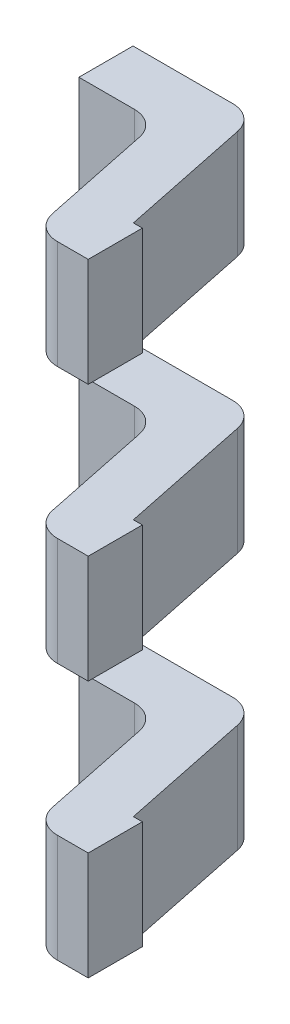
ISO-10303-21;
HEADER;
FILE_DESCRIPTION(('STEP AP214'),'2;1');
FILE_NAME('part.step','',(''),(''),'','','');
FILE_SCHEMA(('AUTOMOTIVE_DESIGN { 1 0 10303 214 1 1 1 1 }'));
ENDSEC;
DATA;
#1=APPLICATION_CONTEXT('core data for automotive mechanical design processes');
#2=APPLICATION_PROTOCOL_DEFINITION('international standard','automotive_design',2000,#1);
#3=PRODUCT_CONTEXT('',#1,'mechanical');
#4=PRODUCT('Part','Part','',(#3));
#5=PRODUCT_RELATED_PRODUCT_CATEGORY('part','',(#4));
#6=PRODUCT_DEFINITION_FORMATION('','',#4);
#7=PRODUCT_DEFINITION_CONTEXT('part definition',#1,'design');
#8=PRODUCT_DEFINITION('design','',#6,#7);
#9=PRODUCT_DEFINITION_SHAPE('','',#8);
#10=(LENGTH_UNIT() NAMED_UNIT(*) SI_UNIT(.MILLI.,.METRE.));
#11=(NAMED_UNIT(*) PLANE_ANGLE_UNIT() SI_UNIT($,.RADIAN.));
#12=(NAMED_UNIT(*) SI_UNIT($,.STERADIAN.) SOLID_ANGLE_UNIT());
#13=UNCERTAINTY_MEASURE_WITH_UNIT(LENGTH_MEASURE(1.E-05),#10,'distance_accuracy_value','');
#14=(GEOMETRIC_REPRESENTATION_CONTEXT(3) GLOBAL_UNCERTAINTY_ASSIGNED_CONTEXT((#13)) GLOBAL_UNIT_ASSIGNED_CONTEXT((#10,
#11,#12)) REPRESENTATION_CONTEXT('',''));
#15=CARTESIAN_POINT('',(0.,0.,0.));
#16=DIRECTION('',(0.,0.,1.));
#17=DIRECTION('',(1.,0.,0.));
#18=AXIS2_PLACEMENT_3D('',#15,#16,#17);
#19=CARTESIAN_POINT('',(-1.053576311495,0.75,0.325748771871));
#20=DIRECTION('',(0.,-1.,0.));
#21=DIRECTION('',(1.,0.,0.));
#22=AXIS2_PLACEMENT_3D('',#19,#20,#21);
#23=PLANE('',#22);
#24=DIRECTION('',(1.,0.,0.));
#25=VECTOR('',#24,1.);
#26=CARTESIAN_POINT('',(-1.4,0.75,0.2));
#27=LINE('',#26,#25);
#28=CARTESIAN_POINT('',(-1.4,0.75,0.2));
#29=VERTEX_POINT('',#28);
#30=CARTESIAN_POINT('',(-1.194284680585,0.75,0.2));
#31=VERTEX_POINT('',#30);
#32=EDGE_CURVE('P0_E86',#29,#31,#27,.T.);
#33=ORIENTED_EDGE('',*,*,#32,.F.);
#34=DIRECTION('',(0.,0.,-1.));
#35=VECTOR('',#34,1.);
#36=CARTESIAN_POINT('',(-1.4,0.75,0.));
#37=LINE('',#36,#35);
#38=CARTESIAN_POINT('',(-1.4,0.75,0.));
#39=VERTEX_POINT('',#38);
#40=EDGE_CURVE('P0_E92',#29,#39,#37,.T.);
#41=ORIENTED_EDGE('',*,*,#40,.T.);
#42=DIRECTION('',(1.,0.,0.));
#43=VECTOR('',#42,1.);
#44=CARTESIAN_POINT('',(-1.4,0.75,0.));
#45=LINE('',#44,#43);
#46=CARTESIAN_POINT('',(-1.031428226862,0.75,0.));
#47=VERTEX_POINT('',#46);
#48=EDGE_CURVE('P0_E178',#39,#47,#45,.T.);
#49=ORIENTED_EDGE('',*,*,#48,.T.);
#50=CARTESIAN_POINT('',(-1.031428226862,0.75,0.1));
#51=DIRECTION('',(0.,1.,0.));
#52=DIRECTION('',(0.,0.,1.));
#53=AXIS2_PLACEMENT_3D('',#50,#51,#52);
#54=CIRCLE('',#53,0.1);
#55=CARTESIAN_POINT('',(-0.933502184911186,0.75,0.0797394395964074));
#56=VERTEX_POINT('',#55);
#57=EDGE_CURVE('P0_E204',#56,#47,#54,.T.);
#58=ORIENTED_EDGE('',*,*,#57,.F.);
#59=DIRECTION('',(-0.202605604036018,0.,-0.979260419507089));
#60=VECTOR('',#59,1.);
#61=CARTESIAN_POINT('',(-0.95,0.75,0.));
#62=LINE('',#61,#60);
#63=CARTESIAN_POINT('',(-0.83299563017783,0.75,0.565521120806977));
#64=VERTEX_POINT('',#63);
#65=EDGE_CURVE('P0_E121',#64,#56,#62,.T.);
#66=ORIENTED_EDGE('',*,*,#65,.F.);
#67=DIRECTION('',(1.,0.,0.));
#68=VECTOR('',#67,1.);
#69=CARTESIAN_POINT('',(-0.995852083901,0.75,0.565521120807));
#70=LINE('',#69,#68);
#71=CARTESIAN_POINT('',(-0.8,0.75,0.565521120807));
#72=VERTEX_POINT('',#71);
#73=EDGE_CURVE('P0_E122',#64,#72,#70,.T.);
#74=ORIENTED_EDGE('',*,*,#73,.T.);
#75=DIRECTION('',(0.,0.,-1.));
#76=VECTOR('',#75,1.);
#77=CARTESIAN_POINT('',(-0.8,0.75,0.565521120807));
#78=LINE('',#77,#76);
#79=CARTESIAN_POINT('',(-0.8,0.75,0.765521120807));
#80=VERTEX_POINT('',#79);
#81=EDGE_CURVE('P0_E118',#80,#72,#78,.T.);
#82=ORIENTED_EDGE('',*,*,#81,.F.);
#83=DIRECTION('',(1.,0.,0.));
#84=VECTOR('',#83,1.);
#85=CARTESIAN_POINT('',(-0.995852083901,0.75,0.765521120807));
#86=LINE('',#85,#84);
#87=CARTESIAN_POINT('',(-0.91442385704,0.75,0.765521120807));
#88=VERTEX_POINT('',#87);
#89=EDGE_CURVE('P0_E151',#88,#80,#86,.T.);
#90=ORIENTED_EDGE('',*,*,#89,.F.);
#91=CARTESIAN_POINT('',(-0.91442385704,0.75,0.665521120807));
#92=DIRECTION('',(0.,1.,0.));
#93=DIRECTION('',(0.,0.,1.));
#94=AXIS2_PLACEMENT_3D('',#91,#92,#93);
#95=CIRCLE('',#94,0.1);
#96=CARTESIAN_POINT('',(-1.01234989899027,0.75,0.685781681210783));
#97=VERTEX_POINT('',#96);
#98=EDGE_CURVE('P0_E155',#97,#88,#95,.T.);
#99=ORIENTED_EDGE('',*,*,#98,.F.);
#100=DIRECTION('',(-0.202605604036018,0.,-0.979260419507089));
#101=VECTOR('',#100,1.);
#102=CARTESIAN_POINT('',(-1.145852083901,0.75,0.04052112080719));
#103=LINE('',#102,#101);
#104=CARTESIAN_POINT('',(-1.09635863863431,0.75,0.279739439596129));
#105=VERTEX_POINT('',#104);
#106=EDGE_CURVE('P0_E79',#97,#105,#103,.T.);
#107=ORIENTED_EDGE('',*,*,#106,.T.);
#108=CARTESIAN_POINT('',(-1.194284680585,0.75,0.3));
#109=DIRECTION('',(0.,1.,0.));
#110=DIRECTION('',(0.,0.,1.));
#111=AXIS2_PLACEMENT_3D('',#108,#109,#110);
#112=CIRCLE('',#111,0.1);
#113=EDGE_CURVE('P0_E20',#105,#31,#112,.T.);
#114=ORIENTED_EDGE('',*,*,#113,.T.);
#115=EDGE_LOOP('',(#33,#41,#49,#58,#66,#74,#82,#90,#99,#107,#114));
#116=FACE_BOUND('',#115,.T.);
#117=ADVANCED_FACE('P0_F17',(#116),#23,.T.);
#118=CARTESIAN_POINT('',(-1.4,0.75,0.));
#119=DIRECTION('',(0.,0.,1.));
#120=DIRECTION('',(1.,0.,0.));
#121=AXIS2_PLACEMENT_3D('',#118,#119,#120);
#122=PLANE('',#121);
#123=ORIENTED_EDGE('',*,*,#48,.F.);
#124=DIRECTION('',(0.,1.,0.));
#125=VECTOR('',#124,1.);
#126=CARTESIAN_POINT('',(-1.4,0.75,0.));
#127=LINE('',#126,#125);
#128=CARTESIAN_POINT('',(-1.4,1.15,0.));
#129=VERTEX_POINT('',#128);
#130=EDGE_CURVE('P0_E162',#39,#129,#127,.T.);
#131=ORIENTED_EDGE('',*,*,#130,.T.);
#132=DIRECTION('',(-1.,0.,0.));
#133=VECTOR('',#132,1.);
#134=CARTESIAN_POINT('',(-1.053576311495,1.15,0.));
#135=LINE('',#134,#133);
#136=CARTESIAN_POINT('',(-1.031428226862,1.15,0.));
#137=VERTEX_POINT('',#136);
#138=EDGE_CURVE('P0_E169',#137,#129,#135,.T.);
#139=ORIENTED_EDGE('',*,*,#138,.F.);
#140=DIRECTION('',(0.,1.,0.));
#141=VECTOR('',#140,1.);
#142=CARTESIAN_POINT('',(-1.031428226862,0.75,0.));
#143=LINE('',#142,#141);
#144=EDGE_CURVE('P0_E229',#47,#137,#143,.T.);
#145=ORIENTED_EDGE('',*,*,#144,.F.);
#146=EDGE_LOOP('',(#123,#131,#139,#145));
#147=FACE_BOUND('',#146,.T.);
#148=ADVANCED_FACE('P0_F247',(#147),#122,.F.);
#149=CARTESIAN_POINT('',(-1.4,0.75,0.));
#150=DIRECTION('',(1.,0.,0.));
#151=DIRECTION('',(0.,0.,-1.));
#152=AXIS2_PLACEMENT_3D('',#149,#150,#151);
#153=PLANE('',#152);
#154=DIRECTION('',(0.,0.,1.));
#155=VECTOR('',#154,1.);
#156=CARTESIAN_POINT('',(-1.4,1.15,0.325748771871));
#157=LINE('',#156,#155);
#158=CARTESIAN_POINT('',(-1.4,1.15,0.2));
#159=VERTEX_POINT('',#158);
#160=EDGE_CURVE('P0_E165',#129,#159,#157,.T.);
#161=ORIENTED_EDGE('',*,*,#160,.F.);
#162=ORIENTED_EDGE('',*,*,#130,.F.);
#163=ORIENTED_EDGE('',*,*,#40,.F.);
#164=DIRECTION('',(0.,1.,0.));
#165=VECTOR('',#164,1.);
#166=CARTESIAN_POINT('',(-1.4,0.75,0.2));
#167=LINE('',#166,#165);
#168=EDGE_CURVE('P0_E160',#159,#29,#167,.F.);
#169=ORIENTED_EDGE('',*,*,#168,.F.);
#170=EDGE_LOOP('',(#161,#162,#163,#169));
#171=FACE_BOUND('',#170,.T.);
#172=ADVANCED_FACE('P0_F249',(#171),#153,.F.);
#173=CARTESIAN_POINT('',(-1.4,0.75,0.2));
#174=DIRECTION('',(0.,0.,1.));
#175=DIRECTION('',(1.,0.,0.));
#176=AXIS2_PLACEMENT_3D('',#173,#174,#175);
#177=PLANE('',#176);
#178=ORIENTED_EDGE('',*,*,#32,.T.);
#179=DIRECTION('',(0.,1.,0.));
#180=VECTOR('',#179,1.);
#181=CARTESIAN_POINT('',(-1.194284680585,0.75,0.2));
#182=LINE('',#181,#180);
#183=CARTESIAN_POINT('',(-1.194284680585,1.15,0.2));
#184=VERTEX_POINT('',#183);
#185=EDGE_CURVE('P0_E158',#31,#184,#182,.T.);
#186=ORIENTED_EDGE('',*,*,#185,.T.);
#187=DIRECTION('',(-1.,0.,0.));
#188=VECTOR('',#187,1.);
#189=CARTESIAN_POINT('',(-1.053576311495,1.15,0.2));
#190=LINE('',#189,#188);
#191=EDGE_CURVE('P0_E168',#159,#184,#190,.F.);
#192=ORIENTED_EDGE('',*,*,#191,.F.);
#193=ORIENTED_EDGE('',*,*,#168,.T.);
#194=EDGE_LOOP('',(#178,#186,#192,#193));
#195=FACE_BOUND('',#194,.T.);
#196=ADVANCED_FACE('P0_F251',(#195),#177,.T.);
#197=CARTESIAN_POINT('',(-1.194284680585,0.75,0.3));
#198=DIRECTION('',(0.,1.,0.));
#199=DIRECTION('',(0.,0.,1.));
#200=AXIS2_PLACEMENT_3D('',#197,#198,#199);
#201=CYLINDRICAL_SURFACE('',#200,0.1);
#202=DIRECTION('',(0.,1.,0.));
#203=VECTOR('',#202,1.);
#204=CARTESIAN_POINT('',(-1.09635863863436,0.75,0.279739439595868));
#205=LINE('',#204,#203);
#206=CARTESIAN_POINT('',(-1.09635863863464,1.15,0.279739439596139));
#207=VERTEX_POINT('',#206);
#208=EDGE_CURVE('P0_E156',#105,#207,#205,.T.);
#209=ORIENTED_EDGE('',*,*,#208,.T.);
#210=CARTESIAN_POINT('',(-1.194284680585,1.15,0.3));
#211=DIRECTION('',(0.,1.,0.));
#212=DIRECTION('',(0.,0.,1.));
#213=AXIS2_PLACEMENT_3D('',#210,#211,#212);
#214=CIRCLE('',#213,0.1);
#215=EDGE_CURVE('P0_E201',#184,#207,#214,.F.);
#216=ORIENTED_EDGE('',*,*,#215,.F.);
#217=ORIENTED_EDGE('',*,*,#185,.F.);
#218=ORIENTED_EDGE('',*,*,#113,.F.);
#219=EDGE_LOOP('',(#209,#216,#217,#218));
#220=FACE_BOUND('',#219,.T.);
#221=ADVANCED_FACE('P0_F254',(#220),#201,.F.);
#222=CARTESIAN_POINT('',(-1.145852083901,0.75,0.04052112080719));
#223=DIRECTION('',(0.979260419507089,0.,-0.202605604036018));
#224=DIRECTION('',(-0.202605604036018,0.,-0.979260419507089));
#225=AXIS2_PLACEMENT_3D('',#222,#223,#224);
#226=PLANE('',#225);
#227=DIRECTION('',(0.202605604037148,0.,0.979260419506855));
#228=VECTOR('',#227,1.);
#229=CARTESIAN_POINT('',(-1.096358638635,1.15,0.279739439596));
#230=LINE('',#229,#228);
#231=CARTESIAN_POINT('',(-1.01234989899034,1.15,0.685781681210857));
#232=VERTEX_POINT('',#231);
#233=EDGE_CURVE('P0_E200',#207,#232,#230,.T.);
#234=ORIENTED_EDGE('',*,*,#233,.F.);
#235=ORIENTED_EDGE('',*,*,#208,.F.);
#236=ORIENTED_EDGE('',*,*,#106,.F.);
#237=DIRECTION('',(0.,1.,0.));
#238=VECTOR('',#237,1.);
#239=CARTESIAN_POINT('',(-1.0123498989906,0.75,0.685781681211124));
#240=LINE('',#239,#238);
#241=EDGE_CURVE('P0_E152',#232,#97,#240,.F.);
#242=ORIENTED_EDGE('',*,*,#241,.F.);
#243=EDGE_LOOP('',(#234,#235,#236,#242));
#244=FACE_BOUND('',#243,.T.);
#245=ADVANCED_FACE('P0_F255',(#244),#226,.F.);
#246=CARTESIAN_POINT('',(-0.91442385704,0.75,0.665521120807));
#247=DIRECTION('',(0.,1.,0.));
#248=DIRECTION('',(0.,0.,1.));
#249=AXIS2_PLACEMENT_3D('',#246,#247,#248);
#250=CYLINDRICAL_SURFACE('',#249,0.1);
#251=CARTESIAN_POINT('',(-0.91442385704,1.15,0.665521120807));
#252=DIRECTION('',(0.,1.,0.));
#253=DIRECTION('',(0.,0.,1.));
#254=AXIS2_PLACEMENT_3D('',#251,#252,#253);
#255=CIRCLE('',#254,0.1);
#256=CARTESIAN_POINT('',(-0.91442385704,1.15,0.765521120807));
#257=VERTEX_POINT('',#256);
#258=EDGE_CURVE('P0_E137',#232,#257,#255,.T.);
#259=ORIENTED_EDGE('',*,*,#258,.F.);
#260=ORIENTED_EDGE('',*,*,#241,.T.);
#261=ORIENTED_EDGE('',*,*,#98,.T.);
#262=DIRECTION('',(0.,1.,0.));
#263=VECTOR('',#262,1.);
#264=CARTESIAN_POINT('',(-0.91442385704,0.75,0.765521120807));
#265=LINE('',#264,#263);
#266=EDGE_CURVE('P0_E148',#257,#88,#265,.F.);
#267=ORIENTED_EDGE('',*,*,#266,.F.);
#268=EDGE_LOOP('',(#259,#260,#261,#267));
#269=FACE_BOUND('',#268,.T.);
#270=ADVANCED_FACE('P0_F209',(#269),#250,.T.);
#271=CARTESIAN_POINT('',(-0.995852083901,0.75,0.765521120807));
#272=DIRECTION('',(0.,0.,1.));
#273=DIRECTION('',(1.,0.,0.));
#274=AXIS2_PLACEMENT_3D('',#271,#272,#273);
#275=PLANE('',#274);
#276=DIRECTION('',(-1.,0.,0.));
#277=VECTOR('',#276,1.);
#278=CARTESIAN_POINT('',(-1.053576311495,1.15,0.765521120807));
#279=LINE('',#278,#277);
#280=CARTESIAN_POINT('',(-0.8,1.15,0.765521120807));
#281=VERTEX_POINT('',#280);
#282=EDGE_CURVE('P0_E135',#257,#281,#279,.F.);
#283=ORIENTED_EDGE('',*,*,#282,.F.);
#284=ORIENTED_EDGE('',*,*,#266,.T.);
#285=ORIENTED_EDGE('',*,*,#89,.T.);
#286=DIRECTION('',(0.,1.,0.));
#287=VECTOR('',#286,1.);
#288=CARTESIAN_POINT('',(-0.8,0.75,0.765521120807));
#289=LINE('',#288,#287);
#290=EDGE_CURVE('P0_E144',#281,#80,#289,.F.);
#291=ORIENTED_EDGE('',*,*,#290,.F.);
#292=EDGE_LOOP('',(#283,#284,#285,#291));
#293=FACE_BOUND('',#292,.T.);
#294=ADVANCED_FACE('P0_F211',(#293),#275,.T.);
#295=CARTESIAN_POINT('',(-0.8,0.75,0.565521120807));
#296=DIRECTION('',(1.,0.,0.));
#297=DIRECTION('',(0.,0.,-1.));
#298=AXIS2_PLACEMENT_3D('',#295,#296,#297);
#299=PLANE('',#298);
#300=DIRECTION('',(0.,0.,1.));
#301=VECTOR('',#300,1.);
#302=CARTESIAN_POINT('',(-0.8,1.15,0.325748771871));
#303=LINE('',#302,#301);
#304=CARTESIAN_POINT('',(-0.8,1.15,0.565521120807));
#305=VERTEX_POINT('',#304);
#306=EDGE_CURVE('P0_E116',#281,#305,#303,.F.);
#307=ORIENTED_EDGE('',*,*,#306,.F.);
#308=ORIENTED_EDGE('',*,*,#290,.T.);
#309=ORIENTED_EDGE('',*,*,#81,.T.);
#310=DIRECTION('',(0.,1.,0.));
#311=VECTOR('',#310,1.);
#312=CARTESIAN_POINT('',(-0.8,0.75,0.565521120807));
#313=LINE('',#312,#311);
#314=EDGE_CURVE('P0_E111',#72,#305,#313,.T.);
#315=ORIENTED_EDGE('',*,*,#314,.T.);
#316=EDGE_LOOP('',(#307,#308,#309,#315));
#317=FACE_BOUND('',#316,.T.);
#318=ADVANCED_FACE('P0_F113',(#317),#299,.T.);
#319=CARTESIAN_POINT('',(-0.995852083901,0.75,0.565521120807));
#320=DIRECTION('',(0.,0.,1.));
#321=DIRECTION('',(1.,0.,0.));
#322=AXIS2_PLACEMENT_3D('',#319,#320,#321);
#323=PLANE('',#322);
#324=ORIENTED_EDGE('',*,*,#73,.F.);
#325=DIRECTION('',(0.,1.,0.));
#326=VECTOR('',#325,1.);
#327=CARTESIAN_POINT('',(-0.83299563017783,0.75,0.565521120806965));
#328=LINE('',#327,#326);
#329=CARTESIAN_POINT('',(-0.832995630177943,1.15,0.565521120806988));
#330=VERTEX_POINT('',#329);
#331=EDGE_CURVE('P0_E128',#330,#64,#328,.F.);
#332=ORIENTED_EDGE('',*,*,#331,.F.);
#333=DIRECTION('',(-1.,0.,0.));
#334=VECTOR('',#333,1.);
#335=CARTESIAN_POINT('',(-1.053576311495,1.15,0.565521120807));
#336=LINE('',#335,#334);
#337=EDGE_CURVE('P0_E125',#305,#330,#336,.T.);
#338=ORIENTED_EDGE('',*,*,#337,.F.);
#339=ORIENTED_EDGE('',*,*,#314,.F.);
#340=EDGE_LOOP('',(#324,#332,#338,#339));
#341=FACE_BOUND('',#340,.T.);
#342=ADVANCED_FACE('P0_F126',(#341),#323,.F.);
#343=CARTESIAN_POINT('',(-0.95,0.75,0.));
#344=DIRECTION('',(0.979260419507089,0.,-0.202605604036018));
#345=DIRECTION('',(-0.202605604036018,0.,-0.979260419507089));
#346=AXIS2_PLACEMENT_3D('',#343,#344,#345);
#347=PLANE('',#346);
#348=DIRECTION('',(-0.202605604035512,0.,-0.979260419507194));
#349=VECTOR('',#348,1.);
#350=CARTESIAN_POINT('',(-0.832995630178,1.15,0.565521120807));
#351=LINE('',#350,#349);
#352=CARTESIAN_POINT('',(-0.93350218491114,1.15,0.0797394395964244));
#353=VERTEX_POINT('',#352);
#354=EDGE_CURVE('P0_E26',#330,#353,#351,.T.);
#355=ORIENTED_EDGE('',*,*,#354,.F.);
#356=ORIENTED_EDGE('',*,*,#331,.T.);
#357=ORIENTED_EDGE('',*,*,#65,.T.);
#358=DIRECTION('',(0.,1.,0.));
#359=VECTOR('',#358,1.);
#360=CARTESIAN_POINT('',(-0.933502184911279,0.75,0.0797394395964577));
#361=LINE('',#360,#359);
#362=EDGE_CURVE('P0_E35',#353,#56,#361,.F.);
#363=ORIENTED_EDGE('',*,*,#362,.F.);
#364=EDGE_LOOP('',(#355,#356,#357,#363));
#365=FACE_BOUND('',#364,.T.);
#366=ADVANCED_FACE('P0_F237',(#365),#347,.T.);
#367=CARTESIAN_POINT('',(-1.031428226862,0.75,0.1));
#368=DIRECTION('',(0.,1.,0.));
#369=DIRECTION('',(0.,0.,1.));
#370=AXIS2_PLACEMENT_3D('',#367,#368,#369);
#371=CYLINDRICAL_SURFACE('',#370,0.1);
#372=ORIENTED_EDGE('',*,*,#362,.T.);
#373=ORIENTED_EDGE('',*,*,#57,.T.);
#374=ORIENTED_EDGE('',*,*,#144,.T.);
#375=CARTESIAN_POINT('',(-1.031428226862,1.15,0.1));
#376=DIRECTION('',(0.,1.,0.));
#377=DIRECTION('',(0.,0.,1.));
#378=AXIS2_PLACEMENT_3D('',#375,#376,#377);
#379=CIRCLE('',#378,0.1);
#380=EDGE_CURVE('P0_E11',#353,#137,#379,.T.);
#381=ORIENTED_EDGE('',*,*,#380,.F.);
#382=EDGE_LOOP('',(#372,#373,#374,#381));
#383=FACE_BOUND('',#382,.T.);
#384=ADVANCED_FACE('P0_F243',(#383),#371,.T.);
#385=CARTESIAN_POINT('',(-1.053576311495,1.15,0.325748771871));
#386=DIRECTION('',(0.,1.,0.));
#387=DIRECTION('',(-1.,0.,0.));
#388=AXIS2_PLACEMENT_3D('',#385,#386,#387);
#389=PLANE('',#388);
#390=ORIENTED_EDGE('',*,*,#354,.T.);
#391=ORIENTED_EDGE('',*,*,#380,.T.);
#392=ORIENTED_EDGE('',*,*,#138,.T.);
#393=ORIENTED_EDGE('',*,*,#160,.T.);
#394=ORIENTED_EDGE('',*,*,#191,.T.);
#395=ORIENTED_EDGE('',*,*,#215,.T.);
#396=ORIENTED_EDGE('',*,*,#233,.T.);
#397=ORIENTED_EDGE('',*,*,#258,.T.);
#398=ORIENTED_EDGE('',*,*,#282,.T.);
#399=ORIENTED_EDGE('',*,*,#306,.T.);
#400=ORIENTED_EDGE('',*,*,#337,.T.);
#401=EDGE_LOOP('',(#390,#391,#392,#393,#394,#395,#396,#397,#398,#399,#400));
#402=FACE_BOUND('',#401,.T.);
#403=ADVANCED_FACE('P0_F132',(#402),#389,.T.);
#404=CLOSED_SHELL('',(#117,#148,#172,#196,#221,#245,#270,#294,#318,#342,#366,#384,#403));
#405=MANIFOLD_SOLID_BREP('P0_B1',#404);
#406=CARTESIAN_POINT('',(-1.053576311495,-0.2,0.325748771871));
#407=DIRECTION('',(0.,-1.,0.));
#408=DIRECTION('',(1.,0.,0.));
#409=AXIS2_PLACEMENT_3D('',#406,#407,#408);
#410=PLANE('',#409);
#411=DIRECTION('',(1.,0.,0.));
#412=VECTOR('',#411,1.);
#413=CARTESIAN_POINT('',(-1.4,-0.2,0.2));
#414=LINE('',#413,#412);
#415=CARTESIAN_POINT('',(-1.4,-0.2,0.2));
#416=VERTEX_POINT('',#415);
#417=CARTESIAN_POINT('',(-1.194284680585,-0.2,0.2));
#418=VERTEX_POINT('',#417);
#419=EDGE_CURVE('P1_E86',#416,#418,#414,.T.);
#420=ORIENTED_EDGE('',*,*,#419,.F.);
#421=DIRECTION('',(0.,0.,-1.));
#422=VECTOR('',#421,1.);
#423=CARTESIAN_POINT('',(-1.4,-0.2,0.));
#424=LINE('',#423,#422);
#425=CARTESIAN_POINT('',(-1.4,-0.2,0.));
#426=VERTEX_POINT('',#425);
#427=EDGE_CURVE('P1_E92',#416,#426,#424,.T.);
#428=ORIENTED_EDGE('',*,*,#427,.T.);
#429=DIRECTION('',(1.,0.,0.));
#430=VECTOR('',#429,1.);
#431=CARTESIAN_POINT('',(-1.4,-0.2,0.));
#432=LINE('',#431,#430);
#433=CARTESIAN_POINT('',(-1.031428226862,-0.2,0.));
#434=VERTEX_POINT('',#433);
#435=EDGE_CURVE('P1_E178',#426,#434,#432,.T.);
#436=ORIENTED_EDGE('',*,*,#435,.T.);
#437=CARTESIAN_POINT('',(-1.031428226862,-0.2,0.1));
#438=DIRECTION('',(0.,1.,0.));
#439=DIRECTION('',(0.,0.,1.));
#440=AXIS2_PLACEMENT_3D('',#437,#438,#439);
#441=CIRCLE('',#440,0.1);
#442=CARTESIAN_POINT('',(-0.933502184911186,-0.2,0.0797394395964074));
#443=VERTEX_POINT('',#442);
#444=EDGE_CURVE('P1_E204',#443,#434,#441,.T.);
#445=ORIENTED_EDGE('',*,*,#444,.F.);
#446=DIRECTION('',(-0.202605604036018,0.,-0.979260419507089));
#447=VECTOR('',#446,1.);
#448=CARTESIAN_POINT('',(-0.95,-0.2,0.));
#449=LINE('',#448,#447);
#450=CARTESIAN_POINT('',(-0.83299563017783,-0.2,0.565521120806977));
#451=VERTEX_POINT('',#450);
#452=EDGE_CURVE('P1_E121',#451,#443,#449,.T.);
#453=ORIENTED_EDGE('',*,*,#452,.F.);
#454=DIRECTION('',(1.,0.,0.));
#455=VECTOR('',#454,1.);
#456=CARTESIAN_POINT('',(-0.995852083901,-0.2,0.565521120807));
#457=LINE('',#456,#455);
#458=CARTESIAN_POINT('',(-0.8,-0.2,0.565521120807));
#459=VERTEX_POINT('',#458);
#460=EDGE_CURVE('P1_E122',#451,#459,#457,.T.);
#461=ORIENTED_EDGE('',*,*,#460,.T.);
#462=DIRECTION('',(0.,0.,-1.));
#463=VECTOR('',#462,1.);
#464=CARTESIAN_POINT('',(-0.8,-0.2,0.565521120807));
#465=LINE('',#464,#463);
#466=CARTESIAN_POINT('',(-0.8,-0.2,0.765521120807));
#467=VERTEX_POINT('',#466);
#468=EDGE_CURVE('P1_E118',#467,#459,#465,.T.);
#469=ORIENTED_EDGE('',*,*,#468,.F.);
#470=DIRECTION('',(1.,0.,0.));
#471=VECTOR('',#470,1.);
#472=CARTESIAN_POINT('',(-0.995852083901,-0.2,0.765521120807));
#473=LINE('',#472,#471);
#474=CARTESIAN_POINT('',(-0.91442385704,-0.2,0.765521120807));
#475=VERTEX_POINT('',#474);
#476=EDGE_CURVE('P1_E151',#475,#467,#473,.T.);
#477=ORIENTED_EDGE('',*,*,#476,.F.);
#478=CARTESIAN_POINT('',(-0.91442385704,-0.2,0.665521120807));
#479=DIRECTION('',(0.,1.,0.));
#480=DIRECTION('',(0.,0.,1.));
#481=AXIS2_PLACEMENT_3D('',#478,#479,#480);
#482=CIRCLE('',#481,0.1);
#483=CARTESIAN_POINT('',(-1.01234989899027,-0.2,0.685781681210783));
#484=VERTEX_POINT('',#483);
#485=EDGE_CURVE('P1_E155',#484,#475,#482,.T.);
#486=ORIENTED_EDGE('',*,*,#485,.F.);
#487=DIRECTION('',(-0.202605604036018,0.,-0.979260419507089));
#488=VECTOR('',#487,1.);
#489=CARTESIAN_POINT('',(-1.145852083901,-0.2,0.04052112080719));
#490=LINE('',#489,#488);
#491=CARTESIAN_POINT('',(-1.09635863863431,-0.2,0.279739439596129));
#492=VERTEX_POINT('',#491);
#493=EDGE_CURVE('P1_E79',#484,#492,#490,.T.);
#494=ORIENTED_EDGE('',*,*,#493,.T.);
#495=CARTESIAN_POINT('',(-1.194284680585,-0.2,0.3));
#496=DIRECTION('',(0.,1.,0.));
#497=DIRECTION('',(0.,0.,1.));
#498=AXIS2_PLACEMENT_3D('',#495,#496,#497);
#499=CIRCLE('',#498,0.1);
#500=EDGE_CURVE('P1_E20',#492,#418,#499,.T.);
#501=ORIENTED_EDGE('',*,*,#500,.T.);
#502=EDGE_LOOP('',(#420,#428,#436,#445,#453,#461,#469,#477,#486,#494,#501));
#503=FACE_BOUND('',#502,.T.);
#504=ADVANCED_FACE('P1_F17',(#503),#410,.T.);
#505=CARTESIAN_POINT('',(-1.4,-0.2,0.));
#506=DIRECTION('',(0.,0.,1.));
#507=DIRECTION('',(1.,0.,0.));
#508=AXIS2_PLACEMENT_3D('',#505,#506,#507);
#509=PLANE('',#508);
#510=ORIENTED_EDGE('',*,*,#435,.F.);
#511=DIRECTION('',(0.,1.,0.));
#512=VECTOR('',#511,1.);
#513=CARTESIAN_POINT('',(-1.4,-0.2,0.));
#514=LINE('',#513,#512);
#515=CARTESIAN_POINT('',(-1.4,0.2,0.));
#516=VERTEX_POINT('',#515);
#517=EDGE_CURVE('P1_E162',#426,#516,#514,.T.);
#518=ORIENTED_EDGE('',*,*,#517,.T.);
#519=DIRECTION('',(-1.,0.,0.));
#520=VECTOR('',#519,1.);
#521=CARTESIAN_POINT('',(-1.053576311495,0.2,0.));
#522=LINE('',#521,#520);
#523=CARTESIAN_POINT('',(-1.031428226862,0.2,0.));
#524=VERTEX_POINT('',#523);
#525=EDGE_CURVE('P1_E169',#524,#516,#522,.T.);
#526=ORIENTED_EDGE('',*,*,#525,.F.);
#527=DIRECTION('',(0.,1.,0.));
#528=VECTOR('',#527,1.);
#529=CARTESIAN_POINT('',(-1.031428226862,-0.2,0.));
#530=LINE('',#529,#528);
#531=EDGE_CURVE('P1_E229',#434,#524,#530,.T.);
#532=ORIENTED_EDGE('',*,*,#531,.F.);
#533=EDGE_LOOP('',(#510,#518,#526,#532));
#534=FACE_BOUND('',#533,.T.);
#535=ADVANCED_FACE('P1_F247',(#534),#509,.F.);
#536=CARTESIAN_POINT('',(-1.4,-0.2,0.));
#537=DIRECTION('',(1.,0.,0.));
#538=DIRECTION('',(0.,0.,-1.));
#539=AXIS2_PLACEMENT_3D('',#536,#537,#538);
#540=PLANE('',#539);
#541=DIRECTION('',(0.,0.,1.));
#542=VECTOR('',#541,1.);
#543=CARTESIAN_POINT('',(-1.4,0.2,0.325748771871));
#544=LINE('',#543,#542);
#545=CARTESIAN_POINT('',(-1.4,0.2,0.2));
#546=VERTEX_POINT('',#545);
#547=EDGE_CURVE('P1_E165',#516,#546,#544,.T.);
#548=ORIENTED_EDGE('',*,*,#547,.F.);
#549=ORIENTED_EDGE('',*,*,#517,.F.);
#550=ORIENTED_EDGE('',*,*,#427,.F.);
#551=DIRECTION('',(0.,1.,0.));
#552=VECTOR('',#551,1.);
#553=CARTESIAN_POINT('',(-1.4,-0.2,0.2));
#554=LINE('',#553,#552);
#555=EDGE_CURVE('P1_E160',#546,#416,#554,.F.);
#556=ORIENTED_EDGE('',*,*,#555,.F.);
#557=EDGE_LOOP('',(#548,#549,#550,#556));
#558=FACE_BOUND('',#557,.T.);
#559=ADVANCED_FACE('P1_F249',(#558),#540,.F.);
#560=CARTESIAN_POINT('',(-1.4,-0.2,0.2));
#561=DIRECTION('',(0.,0.,1.));
#562=DIRECTION('',(1.,0.,0.));
#563=AXIS2_PLACEMENT_3D('',#560,#561,#562);
#564=PLANE('',#563);
#565=ORIENTED_EDGE('',*,*,#419,.T.);
#566=DIRECTION('',(0.,1.,0.));
#567=VECTOR('',#566,1.);
#568=CARTESIAN_POINT('',(-1.194284680585,-0.2,0.2));
#569=LINE('',#568,#567);
#570=CARTESIAN_POINT('',(-1.194284680585,0.2,0.2));
#571=VERTEX_POINT('',#570);
#572=EDGE_CURVE('P1_E158',#418,#571,#569,.T.);
#573=ORIENTED_EDGE('',*,*,#572,.T.);
#574=DIRECTION('',(-1.,0.,0.));
#575=VECTOR('',#574,1.);
#576=CARTESIAN_POINT('',(-1.053576311495,0.2,0.2));
#577=LINE('',#576,#575);
#578=EDGE_CURVE('P1_E168',#546,#571,#577,.F.);
#579=ORIENTED_EDGE('',*,*,#578,.F.);
#580=ORIENTED_EDGE('',*,*,#555,.T.);
#581=EDGE_LOOP('',(#565,#573,#579,#580));
#582=FACE_BOUND('',#581,.T.);
#583=ADVANCED_FACE('P1_F251',(#582),#564,.T.);
#584=CARTESIAN_POINT('',(-1.194284680585,-0.2,0.3));
#585=DIRECTION('',(0.,1.,0.));
#586=DIRECTION('',(0.,0.,1.));
#587=AXIS2_PLACEMENT_3D('',#584,#585,#586);
#588=CYLINDRICAL_SURFACE('',#587,0.1);
#589=DIRECTION('',(0.,1.,0.));
#590=VECTOR('',#589,1.);
#591=CARTESIAN_POINT('',(-1.09635863863436,-0.2,0.279739439595868));
#592=LINE('',#591,#590);
#593=CARTESIAN_POINT('',(-1.09635863863464,0.2,0.279739439596139));
#594=VERTEX_POINT('',#593);
#595=EDGE_CURVE('P1_E156',#492,#594,#592,.T.);
#596=ORIENTED_EDGE('',*,*,#595,.T.);
#597=CARTESIAN_POINT('',(-1.194284680585,0.2,0.3));
#598=DIRECTION('',(0.,1.,0.));
#599=DIRECTION('',(0.,0.,1.));
#600=AXIS2_PLACEMENT_3D('',#597,#598,#599);
#601=CIRCLE('',#600,0.1);
#602=EDGE_CURVE('P1_E201',#571,#594,#601,.F.);
#603=ORIENTED_EDGE('',*,*,#602,.F.);
#604=ORIENTED_EDGE('',*,*,#572,.F.);
#605=ORIENTED_EDGE('',*,*,#500,.F.);
#606=EDGE_LOOP('',(#596,#603,#604,#605));
#607=FACE_BOUND('',#606,.T.);
#608=ADVANCED_FACE('P1_F254',(#607),#588,.F.);
#609=CARTESIAN_POINT('',(-1.145852083901,-0.2,0.04052112080719));
#610=DIRECTION('',(0.979260419507089,0.,-0.202605604036018));
#611=DIRECTION('',(-0.202605604036018,0.,-0.979260419507089));
#612=AXIS2_PLACEMENT_3D('',#609,#610,#611);
#613=PLANE('',#612);
#614=DIRECTION('',(0.202605604037148,0.,0.979260419506855));
#615=VECTOR('',#614,1.);
#616=CARTESIAN_POINT('',(-1.096358638635,0.2,0.279739439596));
#617=LINE('',#616,#615);
#618=CARTESIAN_POINT('',(-1.01234989899034,0.2,0.685781681210857));
#619=VERTEX_POINT('',#618);
#620=EDGE_CURVE('P1_E200',#594,#619,#617,.T.);
#621=ORIENTED_EDGE('',*,*,#620,.F.);
#622=ORIENTED_EDGE('',*,*,#595,.F.);
#623=ORIENTED_EDGE('',*,*,#493,.F.);
#624=DIRECTION('',(0.,1.,0.));
#625=VECTOR('',#624,1.);
#626=CARTESIAN_POINT('',(-1.0123498989906,-0.2,0.685781681211124));
#627=LINE('',#626,#625);
#628=EDGE_CURVE('P1_E152',#619,#484,#627,.F.);
#629=ORIENTED_EDGE('',*,*,#628,.F.);
#630=EDGE_LOOP('',(#621,#622,#623,#629));
#631=FACE_BOUND('',#630,.T.);
#632=ADVANCED_FACE('P1_F255',(#631),#613,.F.);
#633=CARTESIAN_POINT('',(-0.91442385704,-0.2,0.665521120807));
#634=DIRECTION('',(0.,1.,0.));
#635=DIRECTION('',(0.,0.,1.));
#636=AXIS2_PLACEMENT_3D('',#633,#634,#635);
#637=CYLINDRICAL_SURFACE('',#636,0.1);
#638=CARTESIAN_POINT('',(-0.91442385704,0.2,0.665521120807));
#639=DIRECTION('',(0.,1.,0.));
#640=DIRECTION('',(0.,0.,1.));
#641=AXIS2_PLACEMENT_3D('',#638,#639,#640);
#642=CIRCLE('',#641,0.1);
#643=CARTESIAN_POINT('',(-0.91442385704,0.2,0.765521120807));
#644=VERTEX_POINT('',#643);
#645=EDGE_CURVE('P1_E137',#619,#644,#642,.T.);
#646=ORIENTED_EDGE('',*,*,#645,.F.);
#647=ORIENTED_EDGE('',*,*,#628,.T.);
#648=ORIENTED_EDGE('',*,*,#485,.T.);
#649=DIRECTION('',(0.,1.,0.));
#650=VECTOR('',#649,1.);
#651=CARTESIAN_POINT('',(-0.91442385704,-0.2,0.765521120807));
#652=LINE('',#651,#650);
#653=EDGE_CURVE('P1_E148',#644,#475,#652,.F.);
#654=ORIENTED_EDGE('',*,*,#653,.F.);
#655=EDGE_LOOP('',(#646,#647,#648,#654));
#656=FACE_BOUND('',#655,.T.);
#657=ADVANCED_FACE('P1_F209',(#656),#637,.T.);
#658=CARTESIAN_POINT('',(-0.995852083901,-0.2,0.765521120807));
#659=DIRECTION('',(0.,0.,1.));
#660=DIRECTION('',(1.,0.,0.));
#661=AXIS2_PLACEMENT_3D('',#658,#659,#660);
#662=PLANE('',#661);
#663=DIRECTION('',(-1.,0.,0.));
#664=VECTOR('',#663,1.);
#665=CARTESIAN_POINT('',(-1.053576311495,0.2,0.765521120807));
#666=LINE('',#665,#664);
#667=CARTESIAN_POINT('',(-0.8,0.2,0.765521120807));
#668=VERTEX_POINT('',#667);
#669=EDGE_CURVE('P1_E135',#644,#668,#666,.F.);
#670=ORIENTED_EDGE('',*,*,#669,.F.);
#671=ORIENTED_EDGE('',*,*,#653,.T.);
#672=ORIENTED_EDGE('',*,*,#476,.T.);
#673=DIRECTION('',(0.,1.,0.));
#674=VECTOR('',#673,1.);
#675=CARTESIAN_POINT('',(-0.8,-0.2,0.765521120807));
#676=LINE('',#675,#674);
#677=EDGE_CURVE('P1_E144',#668,#467,#676,.F.);
#678=ORIENTED_EDGE('',*,*,#677,.F.);
#679=EDGE_LOOP('',(#670,#671,#672,#678));
#680=FACE_BOUND('',#679,.T.);
#681=ADVANCED_FACE('P1_F211',(#680),#662,.T.);
#682=CARTESIAN_POINT('',(-0.8,-0.2,0.565521120807));
#683=DIRECTION('',(1.,0.,0.));
#684=DIRECTION('',(0.,0.,-1.));
#685=AXIS2_PLACEMENT_3D('',#682,#683,#684);
#686=PLANE('',#685);
#687=DIRECTION('',(0.,0.,1.));
#688=VECTOR('',#687,1.);
#689=CARTESIAN_POINT('',(-0.8,0.2,0.325748771871));
#690=LINE('',#689,#688);
#691=CARTESIAN_POINT('',(-0.8,0.2,0.565521120807));
#692=VERTEX_POINT('',#691);
#693=EDGE_CURVE('P1_E116',#668,#692,#690,.F.);
#694=ORIENTED_EDGE('',*,*,#693,.F.);
#695=ORIENTED_EDGE('',*,*,#677,.T.);
#696=ORIENTED_EDGE('',*,*,#468,.T.);
#697=DIRECTION('',(0.,1.,0.));
#698=VECTOR('',#697,1.);
#699=CARTESIAN_POINT('',(-0.8,-0.2,0.565521120807));
#700=LINE('',#699,#698);
#701=EDGE_CURVE('P1_E111',#459,#692,#700,.T.);
#702=ORIENTED_EDGE('',*,*,#701,.T.);
#703=EDGE_LOOP('',(#694,#695,#696,#702));
#704=FACE_BOUND('',#703,.T.);
#705=ADVANCED_FACE('P1_F113',(#704),#686,.T.);
#706=CARTESIAN_POINT('',(-0.995852083901,-0.2,0.565521120807));
#707=DIRECTION('',(0.,0.,1.));
#708=DIRECTION('',(1.,0.,0.));
#709=AXIS2_PLACEMENT_3D('',#706,#707,#708);
#710=PLANE('',#709);
#711=ORIENTED_EDGE('',*,*,#460,.F.);
#712=DIRECTION('',(0.,1.,0.));
#713=VECTOR('',#712,1.);
#714=CARTESIAN_POINT('',(-0.83299563017783,-0.2,0.565521120806965));
#715=LINE('',#714,#713);
#716=CARTESIAN_POINT('',(-0.832995630177943,0.2,0.565521120806988));
#717=VERTEX_POINT('',#716);
#718=EDGE_CURVE('P1_E128',#717,#451,#715,.F.);
#719=ORIENTED_EDGE('',*,*,#718,.F.);
#720=DIRECTION('',(-1.,0.,0.));
#721=VECTOR('',#720,1.);
#722=CARTESIAN_POINT('',(-1.053576311495,0.2,0.565521120807));
#723=LINE('',#722,#721);
#724=EDGE_CURVE('P1_E125',#692,#717,#723,.T.);
#725=ORIENTED_EDGE('',*,*,#724,.F.);
#726=ORIENTED_EDGE('',*,*,#701,.F.);
#727=EDGE_LOOP('',(#711,#719,#725,#726));
#728=FACE_BOUND('',#727,.T.);
#729=ADVANCED_FACE('P1_F126',(#728),#710,.F.);
#730=CARTESIAN_POINT('',(-0.95,-0.2,0.));
#731=DIRECTION('',(0.979260419507089,0.,-0.202605604036018));
#732=DIRECTION('',(-0.202605604036018,0.,-0.979260419507089));
#733=AXIS2_PLACEMENT_3D('',#730,#731,#732);
#734=PLANE('',#733);
#735=DIRECTION('',(-0.202605604035512,0.,-0.979260419507194));
#736=VECTOR('',#735,1.);
#737=CARTESIAN_POINT('',(-0.832995630178,0.2,0.565521120807));
#738=LINE('',#737,#736);
#739=CARTESIAN_POINT('',(-0.93350218491114,0.2,0.0797394395964244));
#740=VERTEX_POINT('',#739);
#741=EDGE_CURVE('P1_E26',#717,#740,#738,.T.);
#742=ORIENTED_EDGE('',*,*,#741,.F.);
#743=ORIENTED_EDGE('',*,*,#718,.T.);
#744=ORIENTED_EDGE('',*,*,#452,.T.);
#745=DIRECTION('',(0.,1.,0.));
#746=VECTOR('',#745,1.);
#747=CARTESIAN_POINT('',(-0.933502184911279,-0.2,0.0797394395964577));
#748=LINE('',#747,#746);
#749=EDGE_CURVE('P1_E35',#740,#443,#748,.F.);
#750=ORIENTED_EDGE('',*,*,#749,.F.);
#751=EDGE_LOOP('',(#742,#743,#744,#750));
#752=FACE_BOUND('',#751,.T.);
#753=ADVANCED_FACE('P1_F237',(#752),#734,.T.);
#754=CARTESIAN_POINT('',(-1.031428226862,-0.2,0.1));
#755=DIRECTION('',(0.,1.,0.));
#756=DIRECTION('',(0.,0.,1.));
#757=AXIS2_PLACEMENT_3D('',#754,#755,#756);
#758=CYLINDRICAL_SURFACE('',#757,0.1);
#759=ORIENTED_EDGE('',*,*,#749,.T.);
#760=ORIENTED_EDGE('',*,*,#444,.T.);
#761=ORIENTED_EDGE('',*,*,#531,.T.);
#762=CARTESIAN_POINT('',(-1.031428226862,0.2,0.1));
#763=DIRECTION('',(0.,1.,0.));
#764=DIRECTION('',(0.,0.,1.));
#765=AXIS2_PLACEMENT_3D('',#762,#763,#764);
#766=CIRCLE('',#765,0.1);
#767=EDGE_CURVE('P1_E11',#740,#524,#766,.T.);
#768=ORIENTED_EDGE('',*,*,#767,.F.);
#769=EDGE_LOOP('',(#759,#760,#761,#768));
#770=FACE_BOUND('',#769,.T.);
#771=ADVANCED_FACE('P1_F243',(#770),#758,.T.);
#772=CARTESIAN_POINT('',(-1.053576311495,0.2,0.325748771871));
#773=DIRECTION('',(0.,1.,0.));
#774=DIRECTION('',(-1.,0.,0.));
#775=AXIS2_PLACEMENT_3D('',#772,#773,#774);
#776=PLANE('',#775);
#777=ORIENTED_EDGE('',*,*,#741,.T.);
#778=ORIENTED_EDGE('',*,*,#767,.T.);
#779=ORIENTED_EDGE('',*,*,#525,.T.);
#780=ORIENTED_EDGE('',*,*,#547,.T.);
#781=ORIENTED_EDGE('',*,*,#578,.T.);
#782=ORIENTED_EDGE('',*,*,#602,.T.);
#783=ORIENTED_EDGE('',*,*,#620,.T.);
#784=ORIENTED_EDGE('',*,*,#645,.T.);
#785=ORIENTED_EDGE('',*,*,#669,.T.);
#786=ORIENTED_EDGE('',*,*,#693,.T.);
#787=ORIENTED_EDGE('',*,*,#724,.T.);
#788=EDGE_LOOP('',(#777,#778,#779,#780,#781,#782,#783,#784,#785,#786,#787));
#789=FACE_BOUND('',#788,.T.);
#790=ADVANCED_FACE('P1_F132',(#789),#776,.T.);
#791=CLOSED_SHELL('',(#504,#535,#559,#583,#608,#632,#657,#681,#705,#729,#753,#771,#790));
#792=MANIFOLD_SOLID_BREP('P1_B1',#791);
#793=CARTESIAN_POINT('',(-1.053576311495,-1.15,0.325748771871));
#794=DIRECTION('',(0.,-1.,0.));
#795=DIRECTION('',(1.,0.,0.));
#796=AXIS2_PLACEMENT_3D('',#793,#794,#795);
#797=PLANE('',#796);
#798=DIRECTION('',(1.,0.,0.));
#799=VECTOR('',#798,1.);
#800=CARTESIAN_POINT('',(-1.4,-1.15,0.2));
#801=LINE('',#800,#799);
#802=CARTESIAN_POINT('',(-1.4,-1.15,0.2));
#803=VERTEX_POINT('',#802);
#804=CARTESIAN_POINT('',(-1.194284680585,-1.15,0.2));
#805=VERTEX_POINT('',#804);
#806=EDGE_CURVE('P2_E86',#803,#805,#801,.T.);
#807=ORIENTED_EDGE('',*,*,#806,.F.);
#808=DIRECTION('',(0.,0.,-1.));
#809=VECTOR('',#808,1.);
#810=CARTESIAN_POINT('',(-1.4,-1.15,0.));
#811=LINE('',#810,#809);
#812=CARTESIAN_POINT('',(-1.4,-1.15,0.));
#813=VERTEX_POINT('',#812);
#814=EDGE_CURVE('P2_E92',#803,#813,#811,.T.);
#815=ORIENTED_EDGE('',*,*,#814,.T.);
#816=DIRECTION('',(1.,0.,0.));
#817=VECTOR('',#816,1.);
#818=CARTESIAN_POINT('',(-1.4,-1.15,0.));
#819=LINE('',#818,#817);
#820=CARTESIAN_POINT('',(-1.031428226862,-1.15,0.));
#821=VERTEX_POINT('',#820);
#822=EDGE_CURVE('P2_E178',#813,#821,#819,.T.);
#823=ORIENTED_EDGE('',*,*,#822,.T.);
#824=CARTESIAN_POINT('',(-1.031428226862,-1.15,0.1));
#825=DIRECTION('',(0.,1.,0.));
#826=DIRECTION('',(0.,0.,1.));
#827=AXIS2_PLACEMENT_3D('',#824,#825,#826);
#828=CIRCLE('',#827,0.1);
#829=CARTESIAN_POINT('',(-0.933502184911186,-1.15,0.0797394395964074));
#830=VERTEX_POINT('',#829);
#831=EDGE_CURVE('P2_E204',#830,#821,#828,.T.);
#832=ORIENTED_EDGE('',*,*,#831,.F.);
#833=DIRECTION('',(-0.202605604036018,0.,-0.979260419507089));
#834=VECTOR('',#833,1.);
#835=CARTESIAN_POINT('',(-0.95,-1.15,0.));
#836=LINE('',#835,#834);
#837=CARTESIAN_POINT('',(-0.83299563017783,-1.15,0.565521120806977));
#838=VERTEX_POINT('',#837);
#839=EDGE_CURVE('P2_E121',#838,#830,#836,.T.);
#840=ORIENTED_EDGE('',*,*,#839,.F.);
#841=DIRECTION('',(1.,0.,0.));
#842=VECTOR('',#841,1.);
#843=CARTESIAN_POINT('',(-0.995852083901,-1.15,0.565521120807));
#844=LINE('',#843,#842);
#845=CARTESIAN_POINT('',(-0.8,-1.15,0.565521120807));
#846=VERTEX_POINT('',#845);
#847=EDGE_CURVE('P2_E122',#838,#846,#844,.T.);
#848=ORIENTED_EDGE('',*,*,#847,.T.);
#849=DIRECTION('',(0.,0.,-1.));
#850=VECTOR('',#849,1.);
#851=CARTESIAN_POINT('',(-0.8,-1.15,0.565521120807));
#852=LINE('',#851,#850);
#853=CARTESIAN_POINT('',(-0.8,-1.15,0.765521120807));
#854=VERTEX_POINT('',#853);
#855=EDGE_CURVE('P2_E118',#854,#846,#852,.T.);
#856=ORIENTED_EDGE('',*,*,#855,.F.);
#857=DIRECTION('',(1.,0.,0.));
#858=VECTOR('',#857,1.);
#859=CARTESIAN_POINT('',(-0.995852083901,-1.15,0.765521120807));
#860=LINE('',#859,#858);
#861=CARTESIAN_POINT('',(-0.91442385704,-1.15,0.765521120807));
#862=VERTEX_POINT('',#861);
#863=EDGE_CURVE('P2_E151',#862,#854,#860,.T.);
#864=ORIENTED_EDGE('',*,*,#863,.F.);
#865=CARTESIAN_POINT('',(-0.91442385704,-1.15,0.665521120807));
#866=DIRECTION('',(0.,1.,0.));
#867=DIRECTION('',(0.,0.,1.));
#868=AXIS2_PLACEMENT_3D('',#865,#866,#867);
#869=CIRCLE('',#868,0.1);
#870=CARTESIAN_POINT('',(-1.01234989899027,-1.15,0.685781681210783));
#871=VERTEX_POINT('',#870);
#872=EDGE_CURVE('P2_E155',#871,#862,#869,.T.);
#873=ORIENTED_EDGE('',*,*,#872,.F.);
#874=DIRECTION('',(-0.202605604036018,0.,-0.979260419507089));
#875=VECTOR('',#874,1.);
#876=CARTESIAN_POINT('',(-1.145852083901,-1.15,0.04052112080719));
#877=LINE('',#876,#875);
#878=CARTESIAN_POINT('',(-1.09635863863431,-1.15,0.279739439596129));
#879=VERTEX_POINT('',#878);
#880=EDGE_CURVE('P2_E79',#871,#879,#877,.T.);
#881=ORIENTED_EDGE('',*,*,#880,.T.);
#882=CARTESIAN_POINT('',(-1.194284680585,-1.15,0.3));
#883=DIRECTION('',(0.,1.,0.));
#884=DIRECTION('',(0.,0.,1.));
#885=AXIS2_PLACEMENT_3D('',#882,#883,#884);
#886=CIRCLE('',#885,0.1);
#887=EDGE_CURVE('P2_E20',#879,#805,#886,.T.);
#888=ORIENTED_EDGE('',*,*,#887,.T.);
#889=EDGE_LOOP('',(#807,#815,#823,#832,#840,#848,#856,#864,#873,#881,#888));
#890=FACE_BOUND('',#889,.T.);
#891=ADVANCED_FACE('P2_F17',(#890),#797,.T.);
#892=CARTESIAN_POINT('',(-1.4,-1.15,0.));
#893=DIRECTION('',(0.,0.,1.));
#894=DIRECTION('',(1.,0.,0.));
#895=AXIS2_PLACEMENT_3D('',#892,#893,#894);
#896=PLANE('',#895);
#897=ORIENTED_EDGE('',*,*,#822,.F.);
#898=DIRECTION('',(0.,1.,0.));
#899=VECTOR('',#898,1.);
#900=CARTESIAN_POINT('',(-1.4,-1.15,0.));
#901=LINE('',#900,#899);
#902=CARTESIAN_POINT('',(-1.4,-0.75,0.));
#903=VERTEX_POINT('',#902);
#904=EDGE_CURVE('P2_E162',#813,#903,#901,.T.);
#905=ORIENTED_EDGE('',*,*,#904,.T.);
#906=DIRECTION('',(-1.,0.,0.));
#907=VECTOR('',#906,1.);
#908=CARTESIAN_POINT('',(-1.053576311495,-0.75,0.));
#909=LINE('',#908,#907);
#910=CARTESIAN_POINT('',(-1.031428226862,-0.75,0.));
#911=VERTEX_POINT('',#910);
#912=EDGE_CURVE('P2_E169',#911,#903,#909,.T.);
#913=ORIENTED_EDGE('',*,*,#912,.F.);
#914=DIRECTION('',(0.,1.,0.));
#915=VECTOR('',#914,1.);
#916=CARTESIAN_POINT('',(-1.031428226862,-1.15,0.));
#917=LINE('',#916,#915);
#918=EDGE_CURVE('P2_E229',#821,#911,#917,.T.);
#919=ORIENTED_EDGE('',*,*,#918,.F.);
#920=EDGE_LOOP('',(#897,#905,#913,#919));
#921=FACE_BOUND('',#920,.T.);
#922=ADVANCED_FACE('P2_F247',(#921),#896,.F.);
#923=CARTESIAN_POINT('',(-1.4,-1.15,0.));
#924=DIRECTION('',(1.,0.,0.));
#925=DIRECTION('',(0.,0.,-1.));
#926=AXIS2_PLACEMENT_3D('',#923,#924,#925);
#927=PLANE('',#926);
#928=DIRECTION('',(0.,0.,1.));
#929=VECTOR('',#928,1.);
#930=CARTESIAN_POINT('',(-1.4,-0.75,0.325748771871));
#931=LINE('',#930,#929);
#932=CARTESIAN_POINT('',(-1.4,-0.75,0.2));
#933=VERTEX_POINT('',#932);
#934=EDGE_CURVE('P2_E165',#903,#933,#931,.T.);
#935=ORIENTED_EDGE('',*,*,#934,.F.);
#936=ORIENTED_EDGE('',*,*,#904,.F.);
#937=ORIENTED_EDGE('',*,*,#814,.F.);
#938=DIRECTION('',(0.,1.,0.));
#939=VECTOR('',#938,1.);
#940=CARTESIAN_POINT('',(-1.4,-1.15,0.2));
#941=LINE('',#940,#939);
#942=EDGE_CURVE('P2_E160',#933,#803,#941,.F.);
#943=ORIENTED_EDGE('',*,*,#942,.F.);
#944=EDGE_LOOP('',(#935,#936,#937,#943));
#945=FACE_BOUND('',#944,.T.);
#946=ADVANCED_FACE('P2_F249',(#945),#927,.F.);
#947=CARTESIAN_POINT('',(-1.4,-1.15,0.2));
#948=DIRECTION('',(0.,0.,1.));
#949=DIRECTION('',(1.,0.,0.));
#950=AXIS2_PLACEMENT_3D('',#947,#948,#949);
#951=PLANE('',#950);
#952=ORIENTED_EDGE('',*,*,#806,.T.);
#953=DIRECTION('',(0.,1.,0.));
#954=VECTOR('',#953,1.);
#955=CARTESIAN_POINT('',(-1.194284680585,-1.15,0.2));
#956=LINE('',#955,#954);
#957=CARTESIAN_POINT('',(-1.194284680585,-0.75,0.2));
#958=VERTEX_POINT('',#957);
#959=EDGE_CURVE('P2_E158',#805,#958,#956,.T.);
#960=ORIENTED_EDGE('',*,*,#959,.T.);
#961=DIRECTION('',(-1.,0.,0.));
#962=VECTOR('',#961,1.);
#963=CARTESIAN_POINT('',(-1.053576311495,-0.75,0.2));
#964=LINE('',#963,#962);
#965=EDGE_CURVE('P2_E168',#933,#958,#964,.F.);
#966=ORIENTED_EDGE('',*,*,#965,.F.);
#967=ORIENTED_EDGE('',*,*,#942,.T.);
#968=EDGE_LOOP('',(#952,#960,#966,#967));
#969=FACE_BOUND('',#968,.T.);
#970=ADVANCED_FACE('P2_F251',(#969),#951,.T.);
#971=CARTESIAN_POINT('',(-1.194284680585,-1.15,0.3));
#972=DIRECTION('',(0.,1.,0.));
#973=DIRECTION('',(0.,0.,1.));
#974=AXIS2_PLACEMENT_3D('',#971,#972,#973);
#975=CYLINDRICAL_SURFACE('',#974,0.1);
#976=DIRECTION('',(0.,1.,0.));
#977=VECTOR('',#976,1.);
#978=CARTESIAN_POINT('',(-1.09635863863436,-1.15,0.279739439595868));
#979=LINE('',#978,#977);
#980=CARTESIAN_POINT('',(-1.09635863863464,-0.75,0.279739439596139));
#981=VERTEX_POINT('',#980);
#982=EDGE_CURVE('P2_E156',#879,#981,#979,.T.);
#983=ORIENTED_EDGE('',*,*,#982,.T.);
#984=CARTESIAN_POINT('',(-1.194284680585,-0.75,0.3));
#985=DIRECTION('',(0.,1.,0.));
#986=DIRECTION('',(0.,0.,1.));
#987=AXIS2_PLACEMENT_3D('',#984,#985,#986);
#988=CIRCLE('',#987,0.1);
#989=EDGE_CURVE('P2_E201',#958,#981,#988,.F.);
#990=ORIENTED_EDGE('',*,*,#989,.F.);
#991=ORIENTED_EDGE('',*,*,#959,.F.);
#992=ORIENTED_EDGE('',*,*,#887,.F.);
#993=EDGE_LOOP('',(#983,#990,#991,#992));
#994=FACE_BOUND('',#993,.T.);
#995=ADVANCED_FACE('P2_F254',(#994),#975,.F.);
#996=CARTESIAN_POINT('',(-1.145852083901,-1.15,0.04052112080719));
#997=DIRECTION('',(0.979260419507089,0.,-0.202605604036018));
#998=DIRECTION('',(-0.202605604036018,0.,-0.979260419507089));
#999=AXIS2_PLACEMENT_3D('',#996,#997,#998);
#1000=PLANE('',#999);
#1001=DIRECTION('',(0.202605604037148,0.,0.979260419506855));
#1002=VECTOR('',#1001,1.);
#1003=CARTESIAN_POINT('',(-1.096358638635,-0.75,0.279739439596));
#1004=LINE('',#1003,#1002);
#1005=CARTESIAN_POINT('',(-1.01234989899034,-0.75,0.685781681210857));
#1006=VERTEX_POINT('',#1005);
#1007=EDGE_CURVE('P2_E200',#981,#1006,#1004,.T.);
#1008=ORIENTED_EDGE('',*,*,#1007,.F.);
#1009=ORIENTED_EDGE('',*,*,#982,.F.);
#1010=ORIENTED_EDGE('',*,*,#880,.F.);
#1011=DIRECTION('',(0.,1.,0.));
#1012=VECTOR('',#1011,1.);
#1013=CARTESIAN_POINT('',(-1.0123498989906,-1.15,0.685781681211124));
#1014=LINE('',#1013,#1012);
#1015=EDGE_CURVE('P2_E152',#1006,#871,#1014,.F.);
#1016=ORIENTED_EDGE('',*,*,#1015,.F.);
#1017=EDGE_LOOP('',(#1008,#1009,#1010,#1016));
#1018=FACE_BOUND('',#1017,.T.);
#1019=ADVANCED_FACE('P2_F255',(#1018),#1000,.F.);
#1020=CARTESIAN_POINT('',(-0.91442385704,-1.15,0.665521120807));
#1021=DIRECTION('',(0.,1.,0.));
#1022=DIRECTION('',(0.,0.,1.));
#1023=AXIS2_PLACEMENT_3D('',#1020,#1021,#1022);
#1024=CYLINDRICAL_SURFACE('',#1023,0.1);
#1025=CARTESIAN_POINT('',(-0.91442385704,-0.75,0.665521120807));
#1026=DIRECTION('',(0.,1.,0.));
#1027=DIRECTION('',(0.,0.,1.));
#1028=AXIS2_PLACEMENT_3D('',#1025,#1026,#1027);
#1029=CIRCLE('',#1028,0.1);
#1030=CARTESIAN_POINT('',(-0.91442385704,-0.75,0.765521120807));
#1031=VERTEX_POINT('',#1030);
#1032=EDGE_CURVE('P2_E137',#1006,#1031,#1029,.T.);
#1033=ORIENTED_EDGE('',*,*,#1032,.F.);
#1034=ORIENTED_EDGE('',*,*,#1015,.T.);
#1035=ORIENTED_EDGE('',*,*,#872,.T.);
#1036=DIRECTION('',(0.,1.,0.));
#1037=VECTOR('',#1036,1.);
#1038=CARTESIAN_POINT('',(-0.91442385704,-1.15,0.765521120807));
#1039=LINE('',#1038,#1037);
#1040=EDGE_CURVE('P2_E148',#1031,#862,#1039,.F.);
#1041=ORIENTED_EDGE('',*,*,#1040,.F.);
#1042=EDGE_LOOP('',(#1033,#1034,#1035,#1041));
#1043=FACE_BOUND('',#1042,.T.);
#1044=ADVANCED_FACE('P2_F209',(#1043),#1024,.T.);
#1045=CARTESIAN_POINT('',(-0.995852083901,-1.15,0.765521120807));
#1046=DIRECTION('',(0.,0.,1.));
#1047=DIRECTION('',(1.,0.,0.));
#1048=AXIS2_PLACEMENT_3D('',#1045,#1046,#1047);
#1049=PLANE('',#1048);
#1050=DIRECTION('',(-1.,0.,0.));
#1051=VECTOR('',#1050,1.);
#1052=CARTESIAN_POINT('',(-1.053576311495,-0.75,0.765521120807));
#1053=LINE('',#1052,#1051);
#1054=CARTESIAN_POINT('',(-0.8,-0.75,0.765521120807));
#1055=VERTEX_POINT('',#1054);
#1056=EDGE_CURVE('P2_E135',#1031,#1055,#1053,.F.);
#1057=ORIENTED_EDGE('',*,*,#1056,.F.);
#1058=ORIENTED_EDGE('',*,*,#1040,.T.);
#1059=ORIENTED_EDGE('',*,*,#863,.T.);
#1060=DIRECTION('',(0.,1.,0.));
#1061=VECTOR('',#1060,1.);
#1062=CARTESIAN_POINT('',(-0.8,-1.15,0.765521120807));
#1063=LINE('',#1062,#1061);
#1064=EDGE_CURVE('P2_E144',#1055,#854,#1063,.F.);
#1065=ORIENTED_EDGE('',*,*,#1064,.F.);
#1066=EDGE_LOOP('',(#1057,#1058,#1059,#1065));
#1067=FACE_BOUND('',#1066,.T.);
#1068=ADVANCED_FACE('P2_F211',(#1067),#1049,.T.);
#1069=CARTESIAN_POINT('',(-0.8,-1.15,0.565521120807));
#1070=DIRECTION('',(1.,0.,0.));
#1071=DIRECTION('',(0.,0.,-1.));
#1072=AXIS2_PLACEMENT_3D('',#1069,#1070,#1071);
#1073=PLANE('',#1072);
#1074=DIRECTION('',(0.,0.,1.));
#1075=VECTOR('',#1074,1.);
#1076=CARTESIAN_POINT('',(-0.8,-0.75,0.325748771871));
#1077=LINE('',#1076,#1075);
#1078=CARTESIAN_POINT('',(-0.8,-0.75,0.565521120807));
#1079=VERTEX_POINT('',#1078);
#1080=EDGE_CURVE('P2_E116',#1055,#1079,#1077,.F.);
#1081=ORIENTED_EDGE('',*,*,#1080,.F.);
#1082=ORIENTED_EDGE('',*,*,#1064,.T.);
#1083=ORIENTED_EDGE('',*,*,#855,.T.);
#1084=DIRECTION('',(0.,1.,0.));
#1085=VECTOR('',#1084,1.);
#1086=CARTESIAN_POINT('',(-0.8,-1.15,0.565521120807));
#1087=LINE('',#1086,#1085);
#1088=EDGE_CURVE('P2_E111',#846,#1079,#1087,.T.);
#1089=ORIENTED_EDGE('',*,*,#1088,.T.);
#1090=EDGE_LOOP('',(#1081,#1082,#1083,#1089));
#1091=FACE_BOUND('',#1090,.T.);
#1092=ADVANCED_FACE('P2_F113',(#1091),#1073,.T.);
#1093=CARTESIAN_POINT('',(-0.995852083901,-1.15,0.565521120807));
#1094=DIRECTION('',(0.,0.,1.));
#1095=DIRECTION('',(1.,0.,0.));
#1096=AXIS2_PLACEMENT_3D('',#1093,#1094,#1095);
#1097=PLANE('',#1096);
#1098=ORIENTED_EDGE('',*,*,#847,.F.);
#1099=DIRECTION('',(0.,1.,0.));
#1100=VECTOR('',#1099,1.);
#1101=CARTESIAN_POINT('',(-0.83299563017783,-1.15,0.565521120806965));
#1102=LINE('',#1101,#1100);
#1103=CARTESIAN_POINT('',(-0.832995630177943,-0.75,0.565521120806988));
#1104=VERTEX_POINT('',#1103);
#1105=EDGE_CURVE('P2_E128',#1104,#838,#1102,.F.);
#1106=ORIENTED_EDGE('',*,*,#1105,.F.);
#1107=DIRECTION('',(-1.,0.,0.));
#1108=VECTOR('',#1107,1.);
#1109=CARTESIAN_POINT('',(-1.053576311495,-0.75,0.565521120807));
#1110=LINE('',#1109,#1108);
#1111=EDGE_CURVE('P2_E125',#1079,#1104,#1110,.T.);
#1112=ORIENTED_EDGE('',*,*,#1111,.F.);
#1113=ORIENTED_EDGE('',*,*,#1088,.F.);
#1114=EDGE_LOOP('',(#1098,#1106,#1112,#1113));
#1115=FACE_BOUND('',#1114,.T.);
#1116=ADVANCED_FACE('P2_F126',(#1115),#1097,.F.);
#1117=CARTESIAN_POINT('',(-0.95,-1.15,0.));
#1118=DIRECTION('',(0.979260419507089,0.,-0.202605604036018));
#1119=DIRECTION('',(-0.202605604036018,0.,-0.979260419507089));
#1120=AXIS2_PLACEMENT_3D('',#1117,#1118,#1119);
#1121=PLANE('',#1120);
#1122=DIRECTION('',(-0.202605604035512,0.,-0.979260419507194));
#1123=VECTOR('',#1122,1.);
#1124=CARTESIAN_POINT('',(-0.832995630178,-0.75,0.565521120807));
#1125=LINE('',#1124,#1123);
#1126=CARTESIAN_POINT('',(-0.93350218491114,-0.75,0.0797394395964244));
#1127=VERTEX_POINT('',#1126);
#1128=EDGE_CURVE('P2_E26',#1104,#1127,#1125,.T.);
#1129=ORIENTED_EDGE('',*,*,#1128,.F.);
#1130=ORIENTED_EDGE('',*,*,#1105,.T.);
#1131=ORIENTED_EDGE('',*,*,#839,.T.);
#1132=DIRECTION('',(0.,1.,0.));
#1133=VECTOR('',#1132,1.);
#1134=CARTESIAN_POINT('',(-0.933502184911279,-1.15,0.0797394395964577));
#1135=LINE('',#1134,#1133);
#1136=EDGE_CURVE('P2_E35',#1127,#830,#1135,.F.);
#1137=ORIENTED_EDGE('',*,*,#1136,.F.);
#1138=EDGE_LOOP('',(#1129,#1130,#1131,#1137));
#1139=FACE_BOUND('',#1138,.T.);
#1140=ADVANCED_FACE('P2_F237',(#1139),#1121,.T.);
#1141=CARTESIAN_POINT('',(-1.031428226862,-1.15,0.1));
#1142=DIRECTION('',(0.,1.,0.));
#1143=DIRECTION('',(0.,0.,1.));
#1144=AXIS2_PLACEMENT_3D('',#1141,#1142,#1143);
#1145=CYLINDRICAL_SURFACE('',#1144,0.1);
#1146=ORIENTED_EDGE('',*,*,#1136,.T.);
#1147=ORIENTED_EDGE('',*,*,#831,.T.);
#1148=ORIENTED_EDGE('',*,*,#918,.T.);
#1149=CARTESIAN_POINT('',(-1.031428226862,-0.75,0.1));
#1150=DIRECTION('',(0.,1.,0.));
#1151=DIRECTION('',(0.,0.,1.));
#1152=AXIS2_PLACEMENT_3D('',#1149,#1150,#1151);
#1153=CIRCLE('',#1152,0.1);
#1154=EDGE_CURVE('P2_E11',#1127,#911,#1153,.T.);
#1155=ORIENTED_EDGE('',*,*,#1154,.F.);
#1156=EDGE_LOOP('',(#1146,#1147,#1148,#1155));
#1157=FACE_BOUND('',#1156,.T.);
#1158=ADVANCED_FACE('P2_F243',(#1157),#1145,.T.);
#1159=CARTESIAN_POINT('',(-1.053576311495,-0.75,0.325748771871));
#1160=DIRECTION('',(0.,1.,0.));
#1161=DIRECTION('',(-1.,0.,0.));
#1162=AXIS2_PLACEMENT_3D('',#1159,#1160,#1161);
#1163=PLANE('',#1162);
#1164=ORIENTED_EDGE('',*,*,#1128,.T.);
#1165=ORIENTED_EDGE('',*,*,#1154,.T.);
#1166=ORIENTED_EDGE('',*,*,#912,.T.);
#1167=ORIENTED_EDGE('',*,*,#934,.T.);
#1168=ORIENTED_EDGE('',*,*,#965,.T.);
#1169=ORIENTED_EDGE('',*,*,#989,.T.);
#1170=ORIENTED_EDGE('',*,*,#1007,.T.);
#1171=ORIENTED_EDGE('',*,*,#1032,.T.);
#1172=ORIENTED_EDGE('',*,*,#1056,.T.);
#1173=ORIENTED_EDGE('',*,*,#1080,.T.);
#1174=ORIENTED_EDGE('',*,*,#1111,.T.);
#1175=EDGE_LOOP('',(#1164,#1165,#1166,#1167,#1168,#1169,#1170,#1171,#1172,#1173,#1174));
#1176=FACE_BOUND('',#1175,.T.);
#1177=ADVANCED_FACE('P2_F132',(#1176),#1163,.T.);
#1178=CLOSED_SHELL('',(#891,#922,#946,#970,#995,#1019,#1044,#1068,#1092,#1116,#1140,#1158,#1177));
#1179=MANIFOLD_SOLID_BREP('P2_B1',#1178);
#1180=ADVANCED_BREP_SHAPE_REPRESENTATION('',(#18,#405,#792,#1179),#14);
#1181=SHAPE_DEFINITION_REPRESENTATION(#9,#1180);
ENDSEC;
END-ISO-10303-21;
